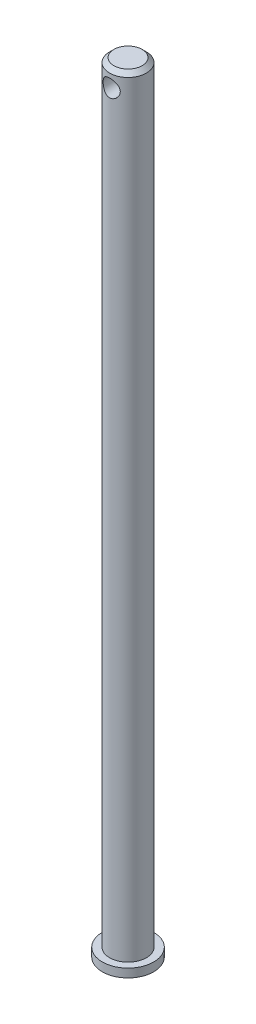
ISO-10303-21;
HEADER;
FILE_DESCRIPTION(('STEP AP214'),'2;1');
FILE_NAME('part.step','',(''),(''),'','','');
FILE_SCHEMA(('AUTOMOTIVE_DESIGN { 1 0 10303 214 1 1 1 1 }'));
ENDSEC;
DATA;
#1=APPLICATION_CONTEXT('core data for automotive mechanical design processes');
#2=APPLICATION_PROTOCOL_DEFINITION('international standard','automotive_design',2000,#1);
#3=PRODUCT_CONTEXT('',#1,'mechanical');
#4=PRODUCT('Part','Part','',(#3));
#5=PRODUCT_RELATED_PRODUCT_CATEGORY('part','',(#4));
#6=PRODUCT_DEFINITION_FORMATION('','',#4);
#7=PRODUCT_DEFINITION_CONTEXT('part definition',#1,'design');
#8=PRODUCT_DEFINITION('design','',#6,#7);
#9=PRODUCT_DEFINITION_SHAPE('','',#8);
#10=(LENGTH_UNIT() NAMED_UNIT(*) SI_UNIT(.MILLI.,.METRE.));
#11=(NAMED_UNIT(*) PLANE_ANGLE_UNIT() SI_UNIT($,.RADIAN.));
#12=(NAMED_UNIT(*) SI_UNIT($,.STERADIAN.) SOLID_ANGLE_UNIT());
#13=UNCERTAINTY_MEASURE_WITH_UNIT(LENGTH_MEASURE(1.E-05),#10,'distance_accuracy_value','');
#14=(GEOMETRIC_REPRESENTATION_CONTEXT(3) GLOBAL_UNCERTAINTY_ASSIGNED_CONTEXT((#13)) GLOBAL_UNIT_ASSIGNED_CONTEXT((#10,
#11,#12)) REPRESENTATION_CONTEXT('',''));
#15=CARTESIAN_POINT('',(0.,0.,0.));
#16=DIRECTION('',(0.,0.,1.));
#17=DIRECTION('',(1.,0.,0.));
#18=AXIS2_PLACEMENT_3D('',#15,#16,#17);
#19=CARTESIAN_POINT('',(0.,90.,0.));
#20=DIRECTION('',(0.,-1.,0.));
#21=DIRECTION('',(0.,0.,-1.));
#22=AXIS2_PLACEMENT_3D('',#19,#20,#21);
#23=CYLINDRICAL_SURFACE('',#22,2.15);
#24=CARTESIAN_POINT('',(0.,89.,-2.15));
#25=CARTESIAN_POINT('',(-0.0530015065688553,88.9999971318863,-2.14999759556961));
#26=CARTESIAN_POINT('',(-0.106078871635338,88.9957614327402,-2.14801851488825));
#27=CARTESIAN_POINT('',(-0.210691812488811,88.9789933309315,-2.14029774990526));
#28=CARTESIAN_POINT('',(-0.262223683535064,88.9664424355727,-2.13454767934728));
#29=CARTESIAN_POINT('',(-0.362068264194535,88.9336258805219,-2.11989230690555));
#30=CARTESIAN_POINT('',(-0.410392098016205,88.9133887139542,-2.11099866662905));
#31=CARTESIAN_POINT('',(-0.50289962413643,88.8659084027037,-2.09089355346165));
#32=CARTESIAN_POINT('',(-0.547084026156541,88.8386664620267,-2.07968247896458));
#33=CARTESIAN_POINT('',(-0.632767352133269,88.7762510655853,-2.05528503380723));
#34=CARTESIAN_POINT('',(-0.673989132585008,88.7407265579892,-2.04202435482376));
#35=CARTESIAN_POINT('',(-0.750138442024738,88.6635030010475,-2.01529750268799));
#36=CARTESIAN_POINT('',(-0.785061855609285,88.6217999467677,-2.00183120136773));
#37=CARTESIAN_POINT('',(-0.849874842358963,88.5301523774577,-1.97522637468372));
#38=CARTESIAN_POINT('',(-0.879292742088817,88.479849274804,-1.96216538237026));
#39=CARTESIAN_POINT('',(-0.929128316474827,88.3743247599105,-1.93906689315005));
#40=CARTESIAN_POINT('',(-0.949551702897248,88.3191064957974,-1.92902747874354));
#41=CARTESIAN_POINT('',(-0.979607688935303,88.2084870874129,-1.91393290980429));
#42=CARTESIAN_POINT('',(-0.989777333734601,88.1532669692936,-1.90863156895033));
#43=CARTESIAN_POINT('',(-1.00069989835215,88.0416699356579,-1.90292984100465));
#44=CARTESIAN_POINT('',(-1.0014600803852,87.9852939459095,-1.90252567428347));
#45=CARTESIAN_POINT('',(-0.993939977895486,87.8790263388143,-1.90646107582332));
#46=CARTESIAN_POINT('',(-0.986556022543201,87.8290499817916,-1.91033037293149));
#47=CARTESIAN_POINT('',(-0.964488544445189,87.7311488152167,-1.92156538552313));
#48=CARTESIAN_POINT('',(-0.949803163607333,87.6832245312567,-1.92893199099224));
#49=CARTESIAN_POINT('',(-0.913261668062484,87.5894579119726,-1.94650211484616));
#50=CARTESIAN_POINT('',(-0.891248210820041,87.5436889350362,-1.95676705614428));
#51=CARTESIAN_POINT('',(-0.840790723235997,87.4562904986723,-1.97897189988324));
#52=CARTESIAN_POINT('',(-0.812343888748173,87.4146628557743,-1.9909125318514));
#53=CARTESIAN_POINT('',(-0.746241758196693,87.3320056256774,-2.01668318704837));
#54=CARTESIAN_POINT('',(-0.707924454001269,87.291523983505,-2.03057814604885));
#55=CARTESIAN_POINT('',(-0.624947878744193,87.217351828108,-2.05763067261934));
#56=CARTESIAN_POINT('',(-0.580286326284135,87.1836637684532,-2.07078797254223));
#57=CARTESIAN_POINT('',(-0.48387149099817,87.1229455999379,-2.09545383853008));
#58=CARTESIAN_POINT('',(-0.431924055890977,87.0961912736143,-2.10688815747596));
#59=CARTESIAN_POINT('',(-0.323597353326433,87.0520022007871,-2.12621796128285));
#60=CARTESIAN_POINT('',(-0.26722117678887,87.0345610195617,-2.13411588892832));
#61=CARTESIAN_POINT('',(-0.15616712791546,87.0107620998567,-2.14499159942002));
#62=CARTESIAN_POINT('',(-0.101677998841081,87.0036724645458,-2.14829341373648));
#63=CARTESIAN_POINT('',(0.00780879040624744,86.9985316064393,-2.15068187986272));
#64=CARTESIAN_POINT('',(0.0628062469152991,87.0004769081422,-2.14977015251132));
#65=CARTESIAN_POINT('',(0.167966523793125,87.0128786554964,-2.14403418243454));
#66=CARTESIAN_POINT('',(0.218211373060017,87.0227741954908,-2.13946785798628));
#67=CARTESIAN_POINT('',(0.316246630697866,87.0499596987311,-2.1271882850323));
#68=CARTESIAN_POINT('',(0.364036750235007,87.0672505299156,-2.11947466715344));
#69=CARTESIAN_POINT('',(0.457482557838052,87.1092614667713,-2.1013200695941));
#70=CARTESIAN_POINT('',(0.503027657080597,87.1341933799422,-2.09080262099177));
#71=CARTESIAN_POINT('',(0.589449481864011,87.1905473257373,-2.06810272822435));
#72=CARTESIAN_POINT('',(0.630324143472607,87.2219722106026,-2.05591955313509));
#73=CARTESIAN_POINT('',(0.710015951743395,87.2936058620164,-2.02984851622042));
#74=CARTESIAN_POINT('',(0.748341819565537,87.3343420135177,-2.01590469319537));
#75=CARTESIAN_POINT('',(0.817799799706968,87.4217928692958,-1.98874266153279));
#76=CARTESIAN_POINT('',(0.848928543158523,87.4685103575153,-1.97552479490295));
#77=CARTESIAN_POINT('',(0.903992795399993,87.5685411442151,-1.950958090356));
#78=CARTESIAN_POINT('',(0.927668459392767,87.6220167971326,-1.93968194212866));
#79=CARTESIAN_POINT('',(0.965439778762677,87.7328931188376,-1.92116526818839));
#80=CARTESIAN_POINT('',(0.979545948454487,87.7902894033007,-1.91392031484997));
#81=CARTESIAN_POINT('',(0.996622439436181,87.9018365340945,-1.90507946281065));
#82=CARTESIAN_POINT('',(1.00047899724712,87.955815983004,-1.90303470762519));
#83=CARTESIAN_POINT('',(0.999426193305112,88.063657847463,-1.90358836647001));
#84=CARTESIAN_POINT('',(0.994519245910947,88.1175202911545,-1.9061855016527));
#85=CARTESIAN_POINT('',(0.976875767904193,88.219549400555,-1.91528058732826));
#86=CARTESIAN_POINT('',(0.964728034159815,88.267847028758,-1.92148440123061));
#87=CARTESIAN_POINT('',(0.933606536005411,88.3616971401763,-1.93679576732553));
#88=CARTESIAN_POINT('',(0.914630743319917,88.4072488030031,-1.94590418223849));
#89=CARTESIAN_POINT('',(0.868965609830067,88.497623927547,-1.96674023380314));
#90=CARTESIAN_POINT('',(0.841849193381477,88.5422000755892,-1.97860123687669));
#91=CARTESIAN_POINT('',(0.781195726547475,88.6264423804405,-2.00332357246873));
#92=CARTESIAN_POINT('',(0.7476556985991,88.6661062461441,-2.01618536724032));
#93=CARTESIAN_POINT('',(0.671176935780949,88.7434824405205,-2.04299290035533));
#94=CARTESIAN_POINT('',(0.627635298398064,88.7806086820084,-2.05691927190843));
#95=CARTESIAN_POINT('',(0.534481934863608,88.8471147387978,-2.08306666242977));
#96=CARTESIAN_POINT('',(0.484867348778639,88.87649088364,-2.09528687207154));
#97=CARTESIAN_POINT('',(0.381079229632198,88.9263226479937,-2.11661728426518));
#98=CARTESIAN_POINT('',(0.326933876307714,88.9468291333004,-2.12574515354212));
#99=CARTESIAN_POINT('',(0.215503473242172,88.9782064034403,-2.13990389962712));
#100=CARTESIAN_POINT('',(0.158228332105166,88.9891059168752,-2.14494698783627));
#101=CARTESIAN_POINT('',(0.0837568336127214,88.9966282834047,-2.14843372929189));
#102=CARTESIAN_POINT('',(0.0670382284991848,88.9978913164566,-2.14901991660245));
#103=CARTESIAN_POINT('',(0.0335489502277251,88.9995776368621,-2.1498034363016));
#104=CARTESIAN_POINT('',(0.0167782760667295,89.0000009079365,-2.15000076115189));
#105=CARTESIAN_POINT('',(0.,89.,-2.15));
#106=B_SPLINE_CURVE_WITH_KNOTS('',3,(#24,#25,#26,#27,#28,#29,#30,#31,#32,#33,#34,#35,#36,#37,
#38,#39,#40,#41,#42,#43,#44,#45,#46,#47,#48,#49,#50,#51,#52,#53,#54,#55,#56,#57,#58,#59,#60,#61,
#62,#63,#64,#65,#66,#67,#68,#69,#70,#71,#72,#73,#74,#75,#76,#77,#78,#79,#80,#81,#82,#83,#84,#85,
#86,#87,#88,#89,#90,#91,#92,#93,#94,#95,#96,#97,#98,#99,#100,#101,#102,#103,#104,#105),
.UNSPECIFIED.,.T.,.F.,(4,2,2,2,2,2,2,2,2,2,2,2,2,2,2,2,2,2,2,2,2,2,2,2,2,2,2,2,2,2,2,2,2,2,2,2,
2,2,2,2,4),(0.,0.158935916980412,0.318226493591029,0.476932251539711,0.635610748783621,
0.802927622258991,0.970353428927153,1.14860802918225,1.32674926900744,1.49498139197074,
1.66308366543118,1.8143778990509,1.965710654275,2.12052835538112,2.27541366810762,
2.44699119102355,2.61863057032872,2.7963056067681,2.97385772300978,3.1381197332459,
3.30231856146145,3.45585453819371,3.60940853942346,3.76767725639675,3.92601564623817,
4.09817939069119,4.27042356003317,4.44813798210011,4.62565682592416,4.78723468287594,
4.94876803175333,5.09867799531379,5.2486325264525,5.40850249047757,5.56844673982692,
5.74429288025439,5.92022215282459,6.09512867819727,6.269510372595,6.31982250844579,
6.37013561961277),.UNSPECIFIED.);
#107=CARTESIAN_POINT('',(0.,89.,-2.15));
#108=VERTEX_POINT('',#107);
#109=EDGE_CURVE('E50',#108,#108,#106,.T.);
#110=ORIENTED_EDGE('',*,*,#109,.T.);
#111=EDGE_LOOP('',(#110));
#112=FACE_BOUND('',#111,.T.);
#113=CARTESIAN_POINT('',(1.,88.,1.90328663106743));
#114=CARTESIAN_POINT('',(0.999996969886066,87.9473491420398,1.90329012212666));
#115=CARTESIAN_POINT('',(0.995814849953161,87.8946195966325,1.90550364952402));
#116=CARTESIAN_POINT('',(0.97927978888591,87.7907358117432,1.91405144818533));
#117=CARTESIAN_POINT('',(0.96690737096254,87.739585632255,1.92039554147314));
#118=CARTESIAN_POINT('',(0.9346112555422,87.6405539201328,1.93631639369869));
#119=CARTESIAN_POINT('',(0.914723518018208,87.5926580836655,1.94587773495715));
#120=CARTESIAN_POINT('',(0.868070040641981,87.5008943850723,1.96713224889848));
#121=CARTESIAN_POINT('',(0.841304772053608,87.4570262472389,1.97882527549755));
#122=CARTESIAN_POINT('',(0.779426709399594,87.3711194444602,2.00404233451796));
#123=CARTESIAN_POINT('',(0.743856767459754,87.3294307447347,2.01763740100444));
#124=CARTESIAN_POINT('',(0.666333872642539,87.2523441815304,2.04454949257859));
#125=CARTESIAN_POINT('',(0.624378094399213,87.2169491177286,2.05786639161249));
#126=CARTESIAN_POINT('',(0.532375608110036,87.1515086078036,2.0836221490583));
#127=CARTESIAN_POINT('',(0.482005974852989,87.1218776273995,2.0959690854546));
#128=CARTESIAN_POINT('',(0.376316298239273,87.0716664829946,2.11749538974238));
#129=CARTESIAN_POINT('',(0.320998988365258,87.0510813580787,2.12667649323905));
#130=CARTESIAN_POINT('',(0.210678023266448,87.0208798984199,2.14032861539472));
#131=CARTESIAN_POINT('',(0.155874037600572,87.010654389063,2.14505986307087));
#132=CARTESIAN_POINT('',(0.0451386235294937,86.9994727722729,2.15023918542634));
#133=CARTESIAN_POINT('',(-0.0107922102961178,86.9985118984148,2.15068946255705));
#134=CARTESIAN_POINT('',(-0.117681015460686,87.0056144189068,2.14739282011829));
#135=CARTESIAN_POINT('',(-0.168695618918996,87.0130019601131,2.143960221331));
#136=CARTESIAN_POINT('',(-0.268663695474788,87.0354046318652,2.13373972495507));
#137=CARTESIAN_POINT('',(-0.317617015242384,87.0504203287545,2.12695157823867));
#138=CARTESIAN_POINT('',(-0.412972480113199,87.0877956849223,2.11052875523577));
#139=CARTESIAN_POINT('',(-0.459325554466008,87.1102617623594,2.10085304741397));
#140=CARTESIAN_POINT('',(-0.547723673479273,87.1617764746651,2.07955983349446));
#141=CARTESIAN_POINT('',(-0.589767130014047,87.1908275235698,2.0679416156877));
#142=CARTESIAN_POINT('',(-0.672141313902426,87.2575263961042,2.04272734448699));
#143=CARTESIAN_POINT('',(-0.712026235289484,87.2956935827577,2.02904711964975));
#144=CARTESIAN_POINT('',(-0.785050427527765,87.3781233725028,2.00192813105651));
#145=CARTESIAN_POINT('',(-0.818185703992254,87.4223895591107,1.98848951454621));
#146=CARTESIAN_POINT('',(-0.878339590180758,87.518455536865,1.96268810444564));
#147=CARTESIAN_POINT('',(-0.904977755201837,87.5705185900045,1.95041059140962));
#148=CARTESIAN_POINT('',(-0.948919884452139,87.6791058010712,1.92941717975123));
#149=CARTESIAN_POINT('',(-0.966232364562271,87.73562583478,1.92069803352577));
#150=CARTESIAN_POINT('',(-0.989749795683114,87.8470574219574,1.90867978842302));
#151=CARTESIAN_POINT('',(-0.996686073673296,87.9017751830499,1.90502533553272));
#152=CARTESIAN_POINT('',(-1.00144155017351,88.0117031276441,1.90253109821574));
#153=CARTESIAN_POINT('',(-0.99926546380403,88.0669130417305,1.90368882376329));
#154=CARTESIAN_POINT('',(-0.986528426678569,88.1710894999243,1.91031486773519));
#155=CARTESIAN_POINT('',(-0.976724484244014,88.2201770046177,1.91539371019158));
#156=CARTESIAN_POINT('',(-0.950080266338138,88.3159418757221,1.92874773550599));
#157=CARTESIAN_POINT('',(-0.933238042304294,88.3626185706716,1.93702380347439));
#158=CARTESIAN_POINT('',(-0.892158692881367,88.4546524928983,1.95629451883553));
#159=CARTESIAN_POINT('',(-0.867617535470594,88.499850731988,1.96739654286693));
#160=CARTESIAN_POINT('',(-0.812116380990752,88.5857338903913,1.99094830936792));
#161=CARTESIAN_POINT('',(-0.781153222455606,88.6264165715554,2.00339871417955));
#162=CARTESIAN_POINT('',(-0.709838810110224,88.7066144358674,2.02983285282106));
#163=CARTESIAN_POINT('',(-0.668840465623032,88.745549257326,2.04383928365761));
#164=CARTESIAN_POINT('',(-0.580616596098677,88.8161347859026,2.07062994711556));
#165=CARTESIAN_POINT('',(-0.533389799739412,88.8477840022869,2.08341392929505));
#166=CARTESIAN_POINT('',(-0.433037589021415,88.9032210467014,2.10657634782161));
#167=CARTESIAN_POINT('',(-0.379837930565255,88.926890848711,2.11691804368677));
#168=CARTESIAN_POINT('',(-0.269596088201233,88.9647315936911,2.13375666393551));
#169=CARTESIAN_POINT('',(-0.212556848818668,88.9789097263916,2.14025649800655));
#170=CARTESIAN_POINT('',(-0.101372539179064,88.9963046467013,2.14827135205389));
#171=CARTESIAN_POINT('',(-0.0473807334212564,89.0003342555808,2.15015565313612));
#172=CARTESIAN_POINT('',(0.0605252387222523,88.9996225497268,2.14982425652881));
#173=CARTESIAN_POINT('',(0.114439421779448,88.994883539135,2.14760963591835));
#174=CARTESIAN_POINT('',(0.217742427347283,88.9773392323816,2.13954119707374));
#175=CARTESIAN_POINT('',(0.267220998081849,88.9649644918482,2.13388183440776));
#176=CARTESIAN_POINT('',(0.363346747644091,88.9330303233505,2.11963251478674));
#177=CARTESIAN_POINT('',(0.409993462219942,88.9134697210292,2.11104207883436));
#178=CARTESIAN_POINT('',(0.501487967024511,88.8667569187191,2.09124373277611));
#179=CARTESIAN_POINT('',(0.546157825811952,88.8393002679505,2.07993466092245));
#180=CARTESIAN_POINT('',(0.630451933733854,88.777978148415,2.05595574827992));
#181=CARTESIAN_POINT('',(0.670073907342268,88.7441098063163,2.04328529850903));
#182=CARTESIAN_POINT('',(0.746750245967828,88.6674955089873,2.01659409543965));
#183=CARTESIAN_POINT('',(0.783283937252356,88.624234376722,2.00255153366779));
#184=CARTESIAN_POINT('',(0.848715433051132,88.5318703135659,1.97571166280033));
#185=CARTESIAN_POINT('',(0.877607880223066,88.4827633188857,1.96291523132782));
#186=CARTESIAN_POINT('',(0.927141463607684,88.3791417440746,1.94001700081743));
#187=CARTESIAN_POINT('',(0.947673096725447,88.3245663842866,1.92995150481632));
#188=CARTESIAN_POINT('',(0.978959118979279,88.2121723178073,1.91427640737765));
#189=CARTESIAN_POINT('',(0.989746333594042,88.154365201975,1.90865185411073));
#190=CARTESIAN_POINT('',(0.99691806192497,88.0800831874559,1.90490284509329));
#191=CARTESIAN_POINT('',(0.998072451735819,88.0640968577116,1.9042983102697));
#192=CARTESIAN_POINT('',(0.999613899532711,88.0320761215873,1.90348966247746));
#193=CARTESIAN_POINT('',(1.00000092321797,88.0160417130903,1.90328556740821));
#194=CARTESIAN_POINT('',(1.,88.,1.90328663106743));
#195=B_SPLINE_CURVE_WITH_KNOTS('',3,(#113,#114,#115,#116,#117,#118,#119,#120,#121,#122,#123,
#124,#125,#126,#127,#128,#129,#130,#131,#132,#133,#134,#135,#136,#137,#138,#139,#140,#141,#142,
#143,#144,#145,#146,#147,#148,#149,#150,#151,#152,#153,#154,#155,#156,#157,#158,#159,#160,#161,
#162,#163,#164,#165,#166,#167,#168,#169,#170,#171,#172,#173,#174,#175,#176,#177,#178,#179,#180,
#181,#182,#183,#184,#185,#186,#187,#188,#189,#190,#191,#192,#193,#194),.UNSPECIFIED.,.T.,.F.,(4,
2,2,2,2,2,2,2,2,2,2,2,2,2,2,2,2,2,2,2,2,2,2,2,2,2,2,2,2,2,2,2,2,2,2,2,2,2,2,2,4),(0.,
0.157885145503367,0.31614710217271,0.473661189470022,0.631164486425479,0.799829655636531,
0.968569667601713,1.14682945181759,1.32499135267854,1.49193238935152,1.65878753442051,
1.81304515145411,1.96731422283983,2.12388921336769,2.28052169704653,2.45040524150683,
2.62038903148827,2.79872326110802,2.97689436504769,3.14179371371441,3.30660774707074,
3.45687512744982,3.60718413724745,3.76439462860143,3.92168269707644,4.09563520828345,
4.2696232809656,4.4460822336975,4.62240737097396,4.7840831238098,4.9457163989256,
5.09897695454769,5.25226256808625,5.41251024217493,5.57282990029641,5.7470531461667,
5.92139821957546,6.09795847241353,6.273921714271,6.32202415930001,6.37012875442933),.UNSPECIFIED.);
#196=CARTESIAN_POINT('',(1.,88.,1.90328663106743));
#197=VERTEX_POINT('',#196);
#198=EDGE_CURVE('E68',#197,#197,#195,.T.);
#199=ORIENTED_EDGE('',*,*,#198,.T.);
#200=EDGE_LOOP('',(#199));
#201=FACE_BOUND('',#200,.T.);
#202=CARTESIAN_POINT('',(0.,89.5,0.));
#203=DIRECTION('',(0.,1.,0.));
#204=DIRECTION('',(0.,0.,1.));
#205=AXIS2_PLACEMENT_3D('',#202,#203,#204);
#206=CIRCLE('',#205,2.15);
#207=CARTESIAN_POINT('',(0.,89.5,2.15));
#208=VERTEX_POINT('',#207);
#209=EDGE_CURVE('E10',#208,#208,#206,.F.);
#210=ORIENTED_EDGE('',*,*,#209,.T.);
#211=EDGE_LOOP('',(#210));
#212=FACE_BOUND('',#211,.T.);
#213=CARTESIAN_POINT('',(0.,0.,0.));
#214=DIRECTION('',(0.,1.,0.));
#215=DIRECTION('',(0.,0.,1.));
#216=AXIS2_PLACEMENT_3D('',#213,#214,#215);
#217=CIRCLE('',#216,2.15);
#218=CARTESIAN_POINT('',(0.,0.,2.15));
#219=VERTEX_POINT('',#218);
#220=EDGE_CURVE('E65',#219,#219,#217,.T.);
#221=ORIENTED_EDGE('',*,*,#220,.T.);
#222=EDGE_LOOP('',(#221));
#223=FACE_BOUND('',#222,.T.);
#224=ADVANCED_FACE('F45',(#112,#201,#212,#223),#23,.T.);
#225=CARTESIAN_POINT('',(0.,90.,0.));
#226=DIRECTION('',(0.,1.,0.));
#227=DIRECTION('',(0.,0.,1.));
#228=AXIS2_PLACEMENT_3D('',#225,#226,#227);
#229=PLANE('',#228);
#230=CARTESIAN_POINT('',(0.,90.,0.));
#231=DIRECTION('',(0.,1.,0.));
#232=DIRECTION('',(0.,0.,1.));
#233=AXIS2_PLACEMENT_3D('',#230,#231,#232);
#234=CIRCLE('',#233,1.65000000000005);
#235=CARTESIAN_POINT('',(0.,90.,1.65000000000005));
#236=VERTEX_POINT('',#235);
#237=EDGE_CURVE('E59',#236,#236,#234,.T.);
#238=ORIENTED_EDGE('',*,*,#237,.T.);
#239=EDGE_LOOP('',(#238));
#240=FACE_BOUND('',#239,.T.);
#241=ADVANCED_FACE('F93',(#240),#229,.T.);
#242=CARTESIAN_POINT('',(0.,90.,0.));
#243=DIRECTION('',(0.,-1.,0.));
#244=DIRECTION('',(0.,0.,-1.));
#245=AXIS2_PLACEMENT_3D('',#242,#243,#244);
#246=CONICAL_SURFACE('',#245,1.65000000000005,0.785398163397436);
#247=ORIENTED_EDGE('',*,*,#209,.F.);
#248=EDGE_LOOP('',(#247));
#249=FACE_BOUND('',#248,.T.);
#250=ORIENTED_EDGE('',*,*,#237,.F.);
#251=EDGE_LOOP('',(#250));
#252=FACE_BOUND('',#251,.T.);
#253=ADVANCED_FACE('F48',(#249,#252),#246,.T.);
#254=CARTESIAN_POINT('',(0.,-1.,0.));
#255=DIRECTION('',(0.,1.,0.));
#256=DIRECTION('',(0.,0.,1.));
#257=AXIS2_PLACEMENT_3D('',#254,#255,#256);
#258=CYLINDRICAL_SURFACE('',#257,3.);
#259=CARTESIAN_POINT('',(0.,-1.,0.));
#260=DIRECTION('',(0.,-1.,0.));
#261=DIRECTION('',(0.,0.,-1.));
#262=AXIS2_PLACEMENT_3D('',#259,#260,#261);
#263=CIRCLE('',#262,3.);
#264=CARTESIAN_POINT('',(0.,-1.,-3.));
#265=VERTEX_POINT('',#264);
#266=EDGE_CURVE('E114',#265,#265,#263,.T.);
#267=ORIENTED_EDGE('',*,*,#266,.F.);
#268=EDGE_LOOP('',(#267));
#269=FACE_BOUND('',#268,.T.);
#270=CARTESIAN_POINT('',(0.,0.,0.));
#271=DIRECTION('',(0.,-1.,0.));
#272=DIRECTION('',(0.,0.,-1.));
#273=AXIS2_PLACEMENT_3D('',#270,#271,#272);
#274=CIRCLE('',#273,3.);
#275=CARTESIAN_POINT('',(0.,0.,-3.));
#276=VERTEX_POINT('',#275);
#277=EDGE_CURVE('E117',#276,#276,#274,.T.);
#278=ORIENTED_EDGE('',*,*,#277,.T.);
#279=EDGE_LOOP('',(#278));
#280=FACE_BOUND('',#279,.T.);
#281=ADVANCED_FACE('F86',(#269,#280),#258,.T.);
#282=CARTESIAN_POINT('',(0.,-1.,0.));
#283=DIRECTION('',(0.,-1.,0.));
#284=DIRECTION('',(0.,0.,-1.));
#285=AXIS2_PLACEMENT_3D('',#282,#283,#284);
#286=PLANE('',#285);
#287=ORIENTED_EDGE('',*,*,#266,.T.);
#288=EDGE_LOOP('',(#287));
#289=FACE_BOUND('',#288,.T.);
#290=ADVANCED_FACE('F82',(#289),#286,.T.);
#291=CARTESIAN_POINT('',(0.,0.,0.));
#292=DIRECTION('',(0.,-1.,0.));
#293=DIRECTION('',(0.,0.,-1.));
#294=AXIS2_PLACEMENT_3D('',#291,#292,#293);
#295=PLANE('',#294);
#296=ORIENTED_EDGE('',*,*,#220,.F.);
#297=EDGE_LOOP('',(#296));
#298=FACE_BOUND('',#297,.T.);
#299=ORIENTED_EDGE('',*,*,#277,.F.);
#300=EDGE_LOOP('',(#299));
#301=FACE_BOUND('',#300,.T.);
#302=ADVANCED_FACE('F80',(#298,#301),#295,.F.);
#303=CARTESIAN_POINT('',(0.,88.,-3.));
#304=DIRECTION('',(0.,0.,1.));
#305=DIRECTION('',(1.,0.,0.));
#306=AXIS2_PLACEMENT_3D('',#303,#304,#305);
#307=CYLINDRICAL_SURFACE('',#306,1.);
#308=ORIENTED_EDGE('',*,*,#198,.F.);
#309=EDGE_LOOP('',(#308));
#310=FACE_BOUND('',#309,.T.);
#311=ORIENTED_EDGE('',*,*,#109,.F.);
#312=EDGE_LOOP('',(#311));
#313=FACE_BOUND('',#312,.T.);
#314=ADVANCED_FACE('F76',(#310,#313),#307,.F.);
#315=CLOSED_SHELL('',(#224,#241,#253,#281,#290,#302,#314));
#316=MANIFOLD_SOLID_BREP('B2',#315);
#317=ADVANCED_BREP_SHAPE_REPRESENTATION('',(#18,#316),#14);
#318=SHAPE_DEFINITION_REPRESENTATION(#9,#317);
ENDSEC;
END-ISO-10303-21;
